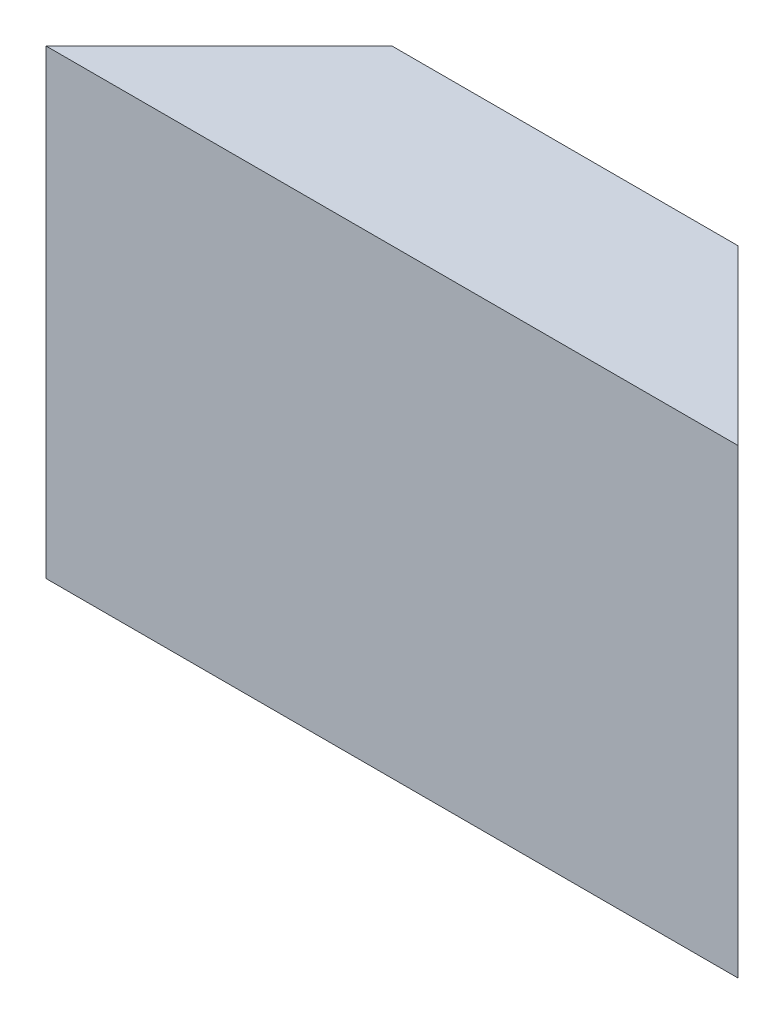
ISO-10303-21;
HEADER;
FILE_DESCRIPTION(('STEP AP214'),'2;1');
FILE_NAME('part.step','',(''),(''),'','','');
FILE_SCHEMA(('AUTOMOTIVE_DESIGN { 1 0 10303 214 1 1 1 1 }'));
ENDSEC;
DATA;
#1=APPLICATION_CONTEXT('core data for automotive mechanical design processes');
#2=APPLICATION_PROTOCOL_DEFINITION('international standard','automotive_design',2000,#1);
#3=PRODUCT_CONTEXT('',#1,'mechanical');
#4=PRODUCT('Part','Part','',(#3));
#5=PRODUCT_RELATED_PRODUCT_CATEGORY('part','',(#4));
#6=PRODUCT_DEFINITION_FORMATION('','',#4);
#7=PRODUCT_DEFINITION_CONTEXT('part definition',#1,'design');
#8=PRODUCT_DEFINITION('design','',#6,#7);
#9=PRODUCT_DEFINITION_SHAPE('','',#8);
#10=(LENGTH_UNIT() NAMED_UNIT(*) SI_UNIT(.MILLI.,.METRE.));
#11=(NAMED_UNIT(*) PLANE_ANGLE_UNIT() SI_UNIT($,.RADIAN.));
#12=(NAMED_UNIT(*) SI_UNIT($,.STERADIAN.) SOLID_ANGLE_UNIT());
#13=UNCERTAINTY_MEASURE_WITH_UNIT(LENGTH_MEASURE(1.E-05),#10,'distance_accuracy_value','');
#14=(GEOMETRIC_REPRESENTATION_CONTEXT(3) GLOBAL_UNCERTAINTY_ASSIGNED_CONTEXT((#13)) GLOBAL_UNIT_ASSIGNED_CONTEXT((#10,
#11,#12)) REPRESENTATION_CONTEXT('',''));
#15=CARTESIAN_POINT('',(0.,0.,0.));
#16=DIRECTION('',(0.,0.,1.));
#17=DIRECTION('',(1.,0.,0.));
#18=AXIS2_PLACEMENT_3D('',#15,#16,#17);
#19=CARTESIAN_POINT('',(15.,40.,-15.));
#20=DIRECTION('',(0.707106781186547,0.,0.707106781186548));
#21=DIRECTION('',(0.707106781186548,0.,-0.707106781186547));
#22=AXIS2_PLACEMENT_3D('',#19,#20,#21);
#23=PLANE('',#22);
#24=DIRECTION('',(-0.707106781186548,0.,0.707106781186547));
#25=VECTOR('',#24,1.);
#26=CARTESIAN_POINT('',(15.,0.,-15.));
#27=LINE('',#26,#25);
#28=CARTESIAN_POINT('',(15.,0.,-15.));
#29=VERTEX_POINT('',#28);
#30=CARTESIAN_POINT('',(0.,0.,0.));
#31=VERTEX_POINT('',#30);
#32=EDGE_CURVE('E99',#29,#31,#27,.T.);
#33=ORIENTED_EDGE('',*,*,#32,.T.);
#34=DIRECTION('',(0.,-1.,0.));
#35=VECTOR('',#34,1.);
#36=CARTESIAN_POINT('',(0.,40.,0.));
#37=LINE('',#36,#35);
#38=CARTESIAN_POINT('',(0.,40.,0.));
#39=VERTEX_POINT('',#38);
#40=EDGE_CURVE('E11',#39,#31,#37,.T.);
#41=ORIENTED_EDGE('',*,*,#40,.F.);
#42=DIRECTION('',(-0.707106781186548,0.,0.707106781186547));
#43=VECTOR('',#42,1.);
#44=CARTESIAN_POINT('',(15.,40.,-15.));
#45=LINE('',#44,#43);
#46=CARTESIAN_POINT('',(15.,40.,-15.));
#47=VERTEX_POINT('',#46);
#48=EDGE_CURVE('E87',#47,#39,#45,.T.);
#49=ORIENTED_EDGE('',*,*,#48,.F.);
#50=DIRECTION('',(0.,-1.,0.));
#51=VECTOR('',#50,1.);
#52=CARTESIAN_POINT('',(15.,40.,-15.));
#53=LINE('',#52,#51);
#54=EDGE_CURVE('E95',#47,#29,#53,.T.);
#55=ORIENTED_EDGE('',*,*,#54,.T.);
#56=EDGE_LOOP('',(#33,#41,#49,#55));
#57=FACE_BOUND('',#56,.T.);
#58=ADVANCED_FACE('F36',(#57),#23,.F.);
#59=CARTESIAN_POINT('',(0.,40.,0.));
#60=DIRECTION('',(0.,0.,-1.));
#61=DIRECTION('',(-1.,0.,0.));
#62=AXIS2_PLACEMENT_3D('',#59,#60,#61);
#63=PLANE('',#62);
#64=DIRECTION('',(1.,0.,0.));
#65=VECTOR('',#64,1.);
#66=CARTESIAN_POINT('',(0.,0.,0.));
#67=LINE('',#66,#65);
#68=CARTESIAN_POINT('',(60.,0.,0.));
#69=VERTEX_POINT('',#68);
#70=EDGE_CURVE('E91',#31,#69,#67,.T.);
#71=ORIENTED_EDGE('',*,*,#70,.T.);
#72=DIRECTION('',(0.,-1.,0.));
#73=VECTOR('',#72,1.);
#74=CARTESIAN_POINT('',(60.,40.,0.));
#75=LINE('',#74,#73);
#76=CARTESIAN_POINT('',(60.,40.,0.));
#77=VERTEX_POINT('',#76);
#78=EDGE_CURVE('E44',#77,#69,#75,.T.);
#79=ORIENTED_EDGE('',*,*,#78,.F.);
#80=DIRECTION('',(1.,0.,0.));
#81=VECTOR('',#80,1.);
#82=CARTESIAN_POINT('',(0.,40.,0.));
#83=LINE('',#82,#81);
#84=EDGE_CURVE('E82',#39,#77,#83,.T.);
#85=ORIENTED_EDGE('',*,*,#84,.F.);
#86=ORIENTED_EDGE('',*,*,#40,.T.);
#87=EDGE_LOOP('',(#71,#79,#85,#86));
#88=FACE_BOUND('',#87,.T.);
#89=ADVANCED_FACE('F90',(#88),#63,.F.);
#90=CARTESIAN_POINT('',(60.,40.,0.));
#91=DIRECTION('',(-0.707106781186548,0.,0.707106781186547));
#92=DIRECTION('',(0.707106781186547,0.,0.707106781186548));
#93=AXIS2_PLACEMENT_3D('',#90,#91,#92);
#94=PLANE('',#93);
#95=DIRECTION('',(-0.707106781186547,0.,-0.707106781186548));
#96=VECTOR('',#95,1.);
#97=CARTESIAN_POINT('',(60.,0.,0.));
#98=LINE('',#97,#96);
#99=CARTESIAN_POINT('',(45.,0.,-15.));
#100=VERTEX_POINT('',#99);
#101=EDGE_CURVE('E69',#69,#100,#98,.T.);
#102=ORIENTED_EDGE('',*,*,#101,.T.);
#103=DIRECTION('',(0.,-1.,0.));
#104=VECTOR('',#103,1.);
#105=CARTESIAN_POINT('',(45.,40.,-15.));
#106=LINE('',#105,#104);
#107=CARTESIAN_POINT('',(45.,40.,-15.));
#108=VERTEX_POINT('',#107);
#109=EDGE_CURVE('E92',#108,#100,#106,.T.);
#110=ORIENTED_EDGE('',*,*,#109,.F.);
#111=DIRECTION('',(-0.707106781186547,0.,-0.707106781186548));
#112=VECTOR('',#111,1.);
#113=CARTESIAN_POINT('',(60.,40.,0.));
#114=LINE('',#113,#112);
#115=EDGE_CURVE('E85',#77,#108,#114,.T.);
#116=ORIENTED_EDGE('',*,*,#115,.F.);
#117=ORIENTED_EDGE('',*,*,#78,.T.);
#118=EDGE_LOOP('',(#102,#110,#116,#117));
#119=FACE_BOUND('',#118,.T.);
#120=ADVANCED_FACE('F93',(#119),#94,.F.);
#121=CARTESIAN_POINT('',(45.,40.,-15.));
#122=DIRECTION('',(0.,0.,1.));
#123=DIRECTION('',(1.,0.,0.));
#124=AXIS2_PLACEMENT_3D('',#121,#122,#123);
#125=PLANE('',#124);
#126=DIRECTION('',(-1.,0.,0.));
#127=VECTOR('',#126,1.);
#128=CARTESIAN_POINT('',(45.,0.,-15.));
#129=LINE('',#128,#127);
#130=EDGE_CURVE('E75',#100,#29,#129,.T.);
#131=ORIENTED_EDGE('',*,*,#130,.T.);
#132=ORIENTED_EDGE('',*,*,#54,.F.);
#133=DIRECTION('',(-1.,0.,0.));
#134=VECTOR('',#133,1.);
#135=CARTESIAN_POINT('',(45.,40.,-15.));
#136=LINE('',#135,#134);
#137=EDGE_CURVE('E52',#108,#47,#136,.T.);
#138=ORIENTED_EDGE('',*,*,#137,.F.);
#139=ORIENTED_EDGE('',*,*,#109,.T.);
#140=EDGE_LOOP('',(#131,#132,#138,#139));
#141=FACE_BOUND('',#140,.T.);
#142=ADVANCED_FACE('F106',(#141),#125,.F.);
#143=CARTESIAN_POINT('',(0.,40.,0.));
#144=DIRECTION('',(0.,-1.,0.));
#145=DIRECTION('',(0.,0.,-1.));
#146=AXIS2_PLACEMENT_3D('',#143,#144,#145);
#147=PLANE('',#146);
#148=ORIENTED_EDGE('',*,*,#48,.T.);
#149=ORIENTED_EDGE('',*,*,#84,.T.);
#150=ORIENTED_EDGE('',*,*,#115,.T.);
#151=ORIENTED_EDGE('',*,*,#137,.T.);
#152=EDGE_LOOP('',(#148,#149,#150,#151));
#153=FACE_BOUND('',#152,.T.);
#154=ADVANCED_FACE('F83',(#153),#147,.F.);
#155=CARTESIAN_POINT('',(0.,0.,0.));
#156=DIRECTION('',(0.,-1.,0.));
#157=DIRECTION('',(0.,0.,-1.));
#158=AXIS2_PLACEMENT_3D('',#155,#156,#157);
#159=PLANE('',#158);
#160=ORIENTED_EDGE('',*,*,#32,.F.);
#161=ORIENTED_EDGE('',*,*,#130,.F.);
#162=ORIENTED_EDGE('',*,*,#101,.F.);
#163=ORIENTED_EDGE('',*,*,#70,.F.);
#164=EDGE_LOOP('',(#160,#161,#162,#163));
#165=FACE_BOUND('',#164,.T.);
#166=ADVANCED_FACE('F109',(#165),#159,.T.);
#167=CLOSED_SHELL('',(#58,#89,#120,#142,#154,#166));
#168=MANIFOLD_SOLID_BREP('B2',#167);
#169=ADVANCED_BREP_SHAPE_REPRESENTATION('',(#18,#168),#14);
#170=SHAPE_DEFINITION_REPRESENTATION(#9,#169);
ENDSEC;
END-ISO-10303-21;
